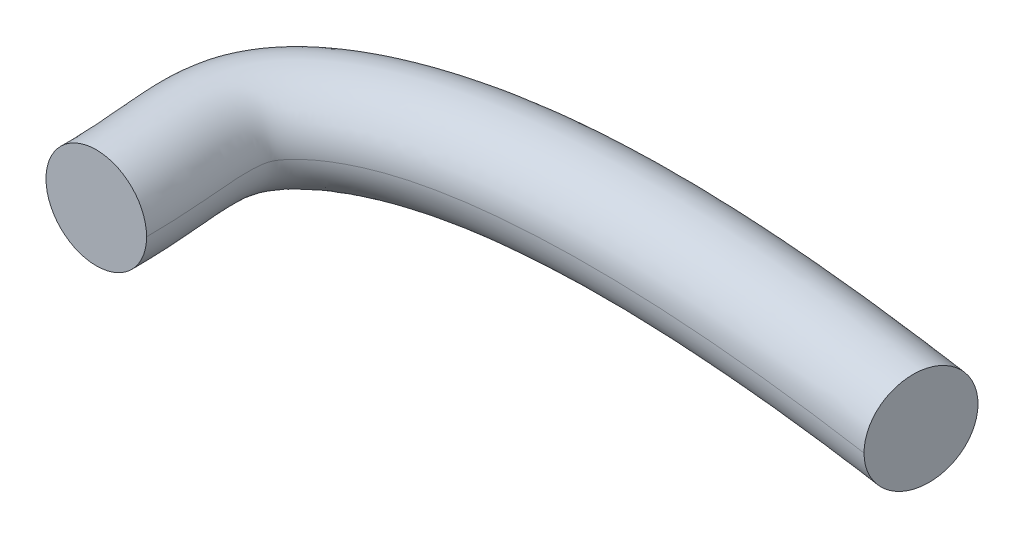
ISO-10303-21;
HEADER;
FILE_DESCRIPTION(('STEP AP214'),'2;1');
FILE_NAME('part.step','',(''),(''),'','','');
FILE_SCHEMA(('AUTOMOTIVE_DESIGN { 1 0 10303 214 1 1 1 1 }'));
ENDSEC;
DATA;
#1=APPLICATION_CONTEXT('core data for automotive mechanical design processes');
#2=APPLICATION_PROTOCOL_DEFINITION('international standard','automotive_design',2000,#1);
#3=PRODUCT_CONTEXT('',#1,'mechanical');
#4=PRODUCT('Part','Part','',(#3));
#5=PRODUCT_RELATED_PRODUCT_CATEGORY('part','',(#4));
#6=PRODUCT_DEFINITION_FORMATION('','',#4);
#7=PRODUCT_DEFINITION_CONTEXT('part definition',#1,'design');
#8=PRODUCT_DEFINITION('design','',#6,#7);
#9=PRODUCT_DEFINITION_SHAPE('','',#8);
#10=(LENGTH_UNIT() NAMED_UNIT(*) SI_UNIT(.MILLI.,.METRE.));
#11=(NAMED_UNIT(*) PLANE_ANGLE_UNIT() SI_UNIT($,.RADIAN.));
#12=(NAMED_UNIT(*) SI_UNIT($,.STERADIAN.) SOLID_ANGLE_UNIT());
#13=UNCERTAINTY_MEASURE_WITH_UNIT(LENGTH_MEASURE(1.E-05),#10,'distance_accuracy_value','');
#14=(GEOMETRIC_REPRESENTATION_CONTEXT(3) GLOBAL_UNCERTAINTY_ASSIGNED_CONTEXT((#13)) GLOBAL_UNIT_ASSIGNED_CONTEXT((#10,
#11,#12)) REPRESENTATION_CONTEXT('',''));
#15=CARTESIAN_POINT('',(0.,0.,0.));
#16=DIRECTION('',(0.,0.,1.));
#17=DIRECTION('',(1.,0.,0.));
#18=AXIS2_PLACEMENT_3D('',#15,#16,#17);
#19=CARTESIAN_POINT('',(-17.5010669160635,17.2,0.7));
#20=DIRECTION('',(0.,0.,1.));
#21=DIRECTION('',(1.,0.,0.));
#22=AXIS2_PLACEMENT_3D('',#19,#20,#21);
#23=PLANE('',#22);
#24=CARTESIAN_POINT('',(-18.0010669160634,17.2,0.7));
#25=CARTESIAN_POINT('',(-18.0010908044007,17.1718715968555,0.699999999999999));
#26=CARTESIAN_POINT('',(-17.9986947232915,17.1437503245222,0.7));
#27=CARTESIAN_POINT('',(-17.9892386494331,17.0883232759033,0.7));
#28=CARTESIAN_POINT('',(-17.9821820701335,17.0610169180443,0.700000000000001));
#29=CARTESIAN_POINT('',(-17.9635762365792,17.0079651780271,0.700000000000001));
#30=CARTESIAN_POINT('',(-17.9520248979197,16.9822205265085,0.7));
#31=CARTESIAN_POINT('',(-17.9247678316505,16.9330405609554,0.7));
#32=CARTESIAN_POINT('',(-17.909062920206,16.9096047944718,0.700000000000001));
#33=CARTESIAN_POINT('',(-17.873952130252,16.8657156692835,0.700000000000001));
#34=CARTESIAN_POINT('',(-17.854548495856,16.8452605153718,0.7));
#35=CARTESIAN_POINT('',(-17.8125548948616,16.8078690222403,0.7));
#36=CARTESIAN_POINT('',(-17.7899604839753,16.7909376739514,0.700000000000001));
#37=CARTESIAN_POINT('',(-17.7422851480738,16.7611345688834,0.700000000000001));
#38=CARTESIAN_POINT('',(-17.7172080947272,16.7482566179668,0.7));
#39=CARTESIAN_POINT('',(-17.6652055193307,16.7268718830678,0.7));
#40=CARTESIAN_POINT('',(-17.6382769821029,16.7183724302786,0.700000000000001));
#41=CARTESIAN_POINT('',(-17.583374631795,16.7060190706367,0.700000000000001));
#42=CARTESIAN_POINT('',(-17.5554008187786,16.7021651635003,0.7));
#43=CARTESIAN_POINT('',(-17.4992503968292,16.6992148253939,0.7));
#44=CARTESIAN_POINT('',(-17.4710742034152,16.7001104788733,0.700000000000001));
#45=CARTESIAN_POINT('',(-17.4152290913618,16.7066205301958,0.700000000000001));
#46=CARTESIAN_POINT('',(-17.3875609994691,16.7122420235647,0.7));
#47=CARTESIAN_POINT('',(-17.3335987676145,16.7280426143909,0.7));
#48=CARTESIAN_POINT('',(-17.3073028396406,16.7382156065342,0.700000000000001));
#49=CARTESIAN_POINT('',(-17.2567728215797,16.762837765867,0.700000000000001));
#50=CARTESIAN_POINT('',(-17.2325401755531,16.7772898967967,0.7));
#51=CARTESIAN_POINT('',(-17.1868463981911,16.8100566513247,0.7));
#52=CARTESIAN_POINT('',(-17.165385130427,16.8283710846734,0.700000000000001));
#53=CARTESIAN_POINT('',(-17.1258407555528,16.8683438436016,0.700000000000001));
#54=CARTESIAN_POINT('',(-17.1077578194591,16.8900023383615,0.7));
#55=CARTESIAN_POINT('',(-17.0754859965782,16.9360471920271,0.7));
#56=CARTESIAN_POINT('',(-17.0612969074891,16.9604334091234,0.700000000000001));
#57=CARTESIAN_POINT('',(-17.0372034896095,17.0112599058752,0.700000000000001));
#58=CARTESIAN_POINT('',(-17.0273025665998,17.0377017986192,0.7));
#59=CARTESIAN_POINT('',(-17.0120996364367,17.0918396699149,0.7));
#60=CARTESIAN_POINT('',(-17.0067906052536,17.1195336646423,0.7));
#61=CARTESIAN_POINT('',(-17.001987525221,17.1649165188812,0.7));
#62=CARTESIAN_POINT('',(-17.0010594466211,17.1824628719965,0.7));
#63=CARTESIAN_POINT('',(-17.0010669160634,17.2,0.7));
#64=B_SPLINE_CURVE_WITH_KNOTS('',3,(#24,#25,#26,#27,#28,#29,#30,#31,#32,#33,#34,#35,#36,#37,#38,
#39,#40,#41,#42,#43,#44,#45,#46,#47,#48,#49,#50,#51,#52,#53,#54,#55,#56,#57,#58,#59,#60,#61,#62,
#63),.UNSPECIFIED.,.F.,.F.,(4,2,2,2,2,2,2,2,2,2,2,2,2,2,2,2,2,2,2,4),(0.,0.0842731266473957,
0.168484598182507,0.252735168669721,0.336969196439847,0.421152278926405,0.505453794405462,
0.589625853237819,0.673938392248186,0.758250926107538,0.842422990094128,0.926721658867325,
1.01090758808816,1.0951519615927,1.17939218635094,1.26363667432552,1.34787678461367,
1.43218367859528,1.5163613825227,1.5689727282428),.UNSPECIFIED.);
#65=CARTESIAN_POINT('',(-18.0010669160634,17.2,0.7));
#66=VERTEX_POINT('',#65);
#67=CARTESIAN_POINT('',(-17.0010669160634,17.2,0.7));
#68=VERTEX_POINT('',#67);
#69=EDGE_CURVE('E55',#66,#68,#64,.T.);
#70=ORIENTED_EDGE('',*,*,#69,.T.);
#71=CARTESIAN_POINT('',(-17.0010669160634,17.2,0.7));
#72=CARTESIAN_POINT('',(-17.0010430277261,17.2281284031445,0.7));
#73=CARTESIAN_POINT('',(-17.0034391088352,17.2562496754778,0.7));
#74=CARTESIAN_POINT('',(-17.0128951826937,17.3116767240967,0.7));
#75=CARTESIAN_POINT('',(-17.0199517619933,17.3389830819557,0.700000000000001));
#76=CARTESIAN_POINT('',(-17.0385575955476,17.3920348219729,0.7));
#77=CARTESIAN_POINT('',(-17.050108934207,17.4177794734915,0.7));
#78=CARTESIAN_POINT('',(-17.0773660004763,17.4669594390446,0.7));
#79=CARTESIAN_POINT('',(-17.0930709119208,17.4903952055281,0.700000000000001));
#80=CARTESIAN_POINT('',(-17.1281817018748,17.5342843307165,0.700000000000001));
#81=CARTESIAN_POINT('',(-17.1475853362708,17.5547394846282,0.7));
#82=CARTESIAN_POINT('',(-17.1895789372652,17.5921309777597,0.7));
#83=CARTESIAN_POINT('',(-17.2121733481515,17.6090623260486,0.700000000000001));
#84=CARTESIAN_POINT('',(-17.259848684053,17.6388654311166,0.700000000000001));
#85=CARTESIAN_POINT('',(-17.2849257373996,17.6517433820332,0.7));
#86=CARTESIAN_POINT('',(-17.3369283127961,17.6731281169322,0.7));
#87=CARTESIAN_POINT('',(-17.3638568500239,17.6816275697214,0.700000000000001));
#88=CARTESIAN_POINT('',(-17.4187592003318,17.6939809293633,0.700000000000001));
#89=CARTESIAN_POINT('',(-17.4467330133482,17.6978348364997,0.7));
#90=CARTESIAN_POINT('',(-17.5028834352976,17.7007851746061,0.7));
#91=CARTESIAN_POINT('',(-17.5310596287116,17.6998895211267,0.700000000000001));
#92=CARTESIAN_POINT('',(-17.586904740765,17.6933794698042,0.700000000000001));
#93=CARTESIAN_POINT('',(-17.6145728326577,17.6877579764353,0.7));
#94=CARTESIAN_POINT('',(-17.6685350645123,17.6719573856091,0.7));
#95=CARTESIAN_POINT('',(-17.6948309924862,17.6617843934658,0.700000000000001));
#96=CARTESIAN_POINT('',(-17.7453610105471,17.637162234133,0.700000000000001));
#97=CARTESIAN_POINT('',(-17.7695936565737,17.6227101032033,0.7));
#98=CARTESIAN_POINT('',(-17.8152874339357,17.5899433486753,0.7));
#99=CARTESIAN_POINT('',(-17.8367487016998,17.5716289153266,0.700000000000001));
#100=CARTESIAN_POINT('',(-17.876293076574,17.5316561563984,0.700000000000001));
#101=CARTESIAN_POINT('',(-17.8943760126677,17.5099976616386,0.7));
#102=CARTESIAN_POINT('',(-17.9266478355486,17.4639528079729,0.7));
#103=CARTESIAN_POINT('',(-17.9408369246377,17.4395665908766,0.700000000000001));
#104=CARTESIAN_POINT('',(-17.9649303425173,17.3887400941248,0.700000000000001));
#105=CARTESIAN_POINT('',(-17.974831265527,17.3622982013808,0.7));
#106=CARTESIAN_POINT('',(-17.9900341956901,17.3081603300851,0.7));
#107=CARTESIAN_POINT('',(-17.9953432268732,17.2804663353577,0.7));
#108=CARTESIAN_POINT('',(-18.0001463069058,17.2350834811188,0.7));
#109=CARTESIAN_POINT('',(-18.0010743855056,17.2175371280035,0.7));
#110=CARTESIAN_POINT('',(-18.0010669160634,17.2,0.7));
#111=B_SPLINE_CURVE_WITH_KNOTS('',3,(#71,#72,#73,#74,#75,#76,#77,#78,#79,#80,#81,#82,#83,#84,
#85,#86,#87,#88,#89,#90,#91,#92,#93,#94,#95,#96,#97,#98,#99,#100,#101,#102,#103,#104,#105,#106,
#107,#108,#109,#110),.UNSPECIFIED.,.F.,.F.,(4,2,2,2,2,2,2,2,2,2,2,2,2,2,2,2,2,2,2,4),(0.,
0.0842731266473989,0.168484598182508,0.252735168669721,0.33696919643984,0.421152278926401,
0.505453794405461,0.589625853237816,0.673938392248183,0.758250926107535,0.842422990094128,
0.926721658867325,1.01090758808817,1.0951519615927,1.17939218635094,1.26363667432552,
1.34787678461367,1.43218367859529,1.51636138252271,1.5689727282428),.UNSPECIFIED.);
#112=EDGE_CURVE('E45',#68,#66,#111,.T.);
#113=ORIENTED_EDGE('',*,*,#112,.T.);
#114=EDGE_LOOP('',(#70,#113));
#115=FACE_BOUND('',#114,.T.);
#116=ADVANCED_FACE('F17',(#115),#23,.T.);
#117=CARTESIAN_POINT('',(-10.1471793061523,17.0266383810018,-0.813800640041871));
#118=CARTESIAN_POINT('',(-10.147950343177,17.0669301913861,-0.809614976968436));
#119=CARTESIAN_POINT('',(-10.1487213802016,17.1072220017704,-0.805429313895));
#120=CARTESIAN_POINT('',(-10.1494924172262,17.1475138121547,-0.801243650821565));
#121=CARTESIAN_POINT('',(-10.1498316435302,17.1652406417112,-0.799402121856344));
#122=CARTESIAN_POINT('',(-10.149993222375,17.1827586206897,-0.798524972533437));
#123=CARTESIAN_POINT('',(-10.149993222375,17.2,-0.798524972533437));
#124=CARTESIAN_POINT('',(-10.1499932223749,18.2,-0.798524972533436));
#125=CARTESIAN_POINT('',(-9.9687017585208,18.2,-1.7826865128359));
#126=CARTESIAN_POINT('',(-9.9687017585208,17.2,-1.7826865128359));
#127=CARTESIAN_POINT('',(-9.9687017585208,17.1827586206897,-1.7826865128359));
#128=CARTESIAN_POINT('',(-9.9688633373656,17.1652406417112,-1.781809363513));
#129=CARTESIAN_POINT('',(-9.9692025636696,17.1475138121547,-1.7799678345478));
#130=CARTESIAN_POINT('',(-9.9699736006942,17.1072220017704,-1.7757821714743));
#131=CARTESIAN_POINT('',(-9.9707446377188,17.0669301913861,-1.7715965084009));
#132=CARTESIAN_POINT('',(-9.9715156747434,17.0266383810018,-1.7674108453275));
#133=CARTESIAN_POINT('',(-10.6216867350942,17.0266383810018,-0.882717746146352));
#134=CARTESIAN_POINT('',(-10.6224045238828,17.0669301913861,-0.878524349338438));
#135=CARTESIAN_POINT('',(-10.6231223126714,17.1072220017704,-0.874330952530524));
#136=CARTESIAN_POINT('',(-10.6238401014601,17.1475138121547,-0.87013755572261));
#137=CARTESIAN_POINT('',(-10.6241559006111,17.1652406417112,-0.868292624214996));
#138=CARTESIAN_POINT('',(-10.6243063207331,17.1827586206897,-0.867413854207422));
#139=CARTESIAN_POINT('',(-10.6243063207331,17.2,-0.867413854207422));
#140=CARTESIAN_POINT('',(-10.624306320733,18.2,-0.867413854207421));
#141=CARTESIAN_POINT('',(-10.4555349439064,18.2,-1.8533938027055));
#142=CARTESIAN_POINT('',(-10.4555349439064,17.2,-1.8533938027055));
#143=CARTESIAN_POINT('',(-10.4555349439064,17.1827586206897,-1.8533938027055));
#144=CARTESIAN_POINT('',(-10.4556853640284,17.1652406417112,-1.8525150326979));
#145=CARTESIAN_POINT('',(-10.4560011631794,17.1475138121547,-1.8506701011903));
#146=CARTESIAN_POINT('',(-10.456718951968,17.1072220017704,-1.8464767043824));
#147=CARTESIAN_POINT('',(-10.4574367407567,17.0669301913861,-1.8422833075745));
#148=CARTESIAN_POINT('',(-10.4581545295453,17.0266383810018,-1.8380899107665));
#149=CARTESIAN_POINT('',(-11.096194164036,17.0266383810018,-0.951634852250831));
#150=CARTESIAN_POINT('',(-11.0968587045887,17.0669301913861,-0.947433721708439));
#151=CARTESIAN_POINT('',(-11.0975232451413,17.1072220017704,-0.943232591166047));
#152=CARTESIAN_POINT('',(-11.098187785694,17.1475138121547,-0.939031460623655));
#153=CARTESIAN_POINT('',(-11.0984801576921,17.1652406417112,-0.937183126573647));
#154=CARTESIAN_POINT('',(-11.0986194190912,17.1827586206897,-0.936302735881407));
#155=CARTESIAN_POINT('',(-11.0986194190912,17.2,-0.936302735881407));
#156=CARTESIAN_POINT('',(-11.0986194190912,18.2,-0.936302735881406));
#157=CARTESIAN_POINT('',(-10.942368129292,18.2,-1.924101092575));
#158=CARTESIAN_POINT('',(-10.942368129292,17.2,-1.924101092575));
#159=CARTESIAN_POINT('',(-10.942368129292,17.1827586206897,-1.924101092575));
#160=CARTESIAN_POINT('',(-10.9425073906911,17.1652406417112,-1.9232207018828));
#161=CARTESIAN_POINT('',(-10.9427997626892,17.1475138121547,-1.9213723678328));
#162=CARTESIAN_POINT('',(-10.9434643032419,17.1072220017704,-1.9171712372904));
#163=CARTESIAN_POINT('',(-10.9441288437945,17.0669301913861,-1.912970106748));
#164=CARTESIAN_POINT('',(-10.9447933843472,17.0266383810018,-1.9087689762056));
#165=CARTESIAN_POINT('',(-11.5707015929779,17.0266383810018,-1.0205519583553));
#166=CARTESIAN_POINT('',(-11.5713128852945,17.0669301913861,-1.0163430940784));
#167=CARTESIAN_POINT('',(-11.5719241776112,17.1072220017704,-1.0121342298016));
#168=CARTESIAN_POINT('',(-11.5725354699278,17.1475138121547,-1.0079253655247));
#169=CARTESIAN_POINT('',(-11.572804414773,17.1652406417112,-1.0060736289323));
#170=CARTESIAN_POINT('',(-11.5729325174493,17.1827586206897,-1.0051916175554));
#171=CARTESIAN_POINT('',(-11.5729325174493,17.2,-1.0051916175554));
#172=CARTESIAN_POINT('',(-11.5729325174493,18.2,-1.0051916175554));
#173=CARTESIAN_POINT('',(-11.4292013146776,18.2,-1.9948083824446));
#174=CARTESIAN_POINT('',(-11.4292013146776,17.2,-1.9948083824446));
#175=CARTESIAN_POINT('',(-11.4292013146776,17.1827586206897,-1.9948083824446));
#176=CARTESIAN_POINT('',(-11.4293294173538,17.1652406417112,-1.9939263710677));
#177=CARTESIAN_POINT('',(-11.429598362199,17.1475138121547,-1.9920746344753));
#178=CARTESIAN_POINT('',(-11.4302096545157,17.1072220017704,-1.9878657701984));
#179=CARTESIAN_POINT('',(-11.4308209468324,17.0669301913861,-1.9836569059216));
#180=CARTESIAN_POINT('',(-11.431432239149,17.0266383810018,-1.9794480416447));
#181=CARTESIAN_POINT('',(-13.9111578650092,17.0266383810018,-1.3604780867874));
#182=CARTESIAN_POINT('',(-13.9115065161947,17.0669301913861,-1.3562310767066));
#183=CARTESIAN_POINT('',(-13.9118551673801,17.1072220017704,-1.3519840666258));
#184=CARTESIAN_POINT('',(-13.9122038185656,17.1475138121547,-1.3477370565449));
#185=CARTESIAN_POINT('',(-13.9123572115276,17.1652406417112,-1.3458685372823));
#186=CARTESIAN_POINT('',(-13.9124302750174,17.1827586206897,-1.3449785320546));
#187=CARTESIAN_POINT('',(-13.9124302750174,17.2,-1.3449785320546));
#188=CARTESIAN_POINT('',(-13.9124302750174,18.2,-1.3449785320546));
#189=CARTESIAN_POINT('',(-13.83045303946,18.2,-2.3435643975456));
#190=CARTESIAN_POINT('',(-13.83045303946,17.2,-2.3435643975456));
#191=CARTESIAN_POINT('',(-13.83045303946,17.1827586206897,-2.3435643975456));
#192=CARTESIAN_POINT('',(-13.8305261029498,17.1652406417112,-2.3426743923179));
#193=CARTESIAN_POINT('',(-13.8306794959118,17.1475138121547,-2.3408058730553));
#194=CARTESIAN_POINT('',(-13.8310281470973,17.1072220017704,-2.3365588629744));
#195=CARTESIAN_POINT('',(-13.8313767982828,17.0669301913861,-2.3323118528936));
#196=CARTESIAN_POINT('',(-13.8317254494683,17.0266383810018,-2.3280648428128));
#197=CARTESIAN_POINT('',(-15.5288191612442,17.0266383810018,-1.344804822665));
#198=CARTESIAN_POINT('',(-15.5288110738282,17.0669301913861,-1.3402953603798));
#199=CARTESIAN_POINT('',(-15.5288029864123,17.1072220017704,-1.3357858980946));
#200=CARTESIAN_POINT('',(-15.5287948989963,17.1475138121547,-1.3312764358093));
#201=CARTESIAN_POINT('',(-15.5287913408478,17.1652406417112,-1.329292447784));
#202=CARTESIAN_POINT('',(-15.5287896460455,17.1827586206897,-1.3283474429614));
#203=CARTESIAN_POINT('',(-15.5287896460456,17.2,-1.3283474429613));
#204=CARTESIAN_POINT('',(-15.5287896460474,18.2,-1.3283474429606));
#205=CARTESIAN_POINT('',(-15.5306912142562,18.2,-2.3886428539114));
#206=CARTESIAN_POINT('',(-15.5306912142534,17.2,-2.3886428539121));
#207=CARTESIAN_POINT('',(-15.5306912142534,17.1827586206897,-2.3886428539121));
#208=CARTESIAN_POINT('',(-15.530689519451,17.1652406417112,-2.3876978490895));
#209=CARTESIAN_POINT('',(-15.5306859613024,17.1475138121547,-2.3857138610642));
#210=CARTESIAN_POINT('',(-15.5306778738863,17.1072220017704,-2.381204398779));
#211=CARTESIAN_POINT('',(-15.5306697864701,17.0669301913861,-2.3766949364938));
#212=CARTESIAN_POINT('',(-15.530661699054,17.0266383810018,-2.3721854742086));
#213=CARTESIAN_POINT('',(-16.7983849518084,17.0266383810018,-0.894768994742262));
#214=CARTESIAN_POINT('',(-16.7962675036495,17.0669301913861,-0.891007259145851));
#215=CARTESIAN_POINT('',(-16.7941500554907,17.1072220017704,-0.887245523549439));
#216=CARTESIAN_POINT('',(-16.7920326073318,17.1475138121547,-0.883483787953028));
#217=CARTESIAN_POINT('',(-16.7911010124928,17.1652406417112,-0.881828770590484));
#218=CARTESIAN_POINT('',(-16.7906572791616,17.1827586206897,-0.881040459688855));
#219=CARTESIAN_POINT('',(-16.7906572791616,17.2,-0.881040459688861));
#220=CARTESIAN_POINT('',(-16.7906572791607,18.2,-0.881040459689203));
#221=CARTESIAN_POINT('',(-17.2885260767541,18.2,-1.7655252913242));
#222=CARTESIAN_POINT('',(-17.2885260767555,17.2,-1.7655252913239));
#223=CARTESIAN_POINT('',(-17.2885260767555,17.1827586206897,-1.7655252913239));
#224=CARTESIAN_POINT('',(-17.2880823434243,17.1652406417112,-1.7647369804222));
#225=CARTESIAN_POINT('',(-17.2871507485854,17.1475138121547,-1.7630819630597));
#226=CARTESIAN_POINT('',(-17.2850333004266,17.1072220017704,-1.7593202274632));
#227=CARTESIAN_POINT('',(-17.2829158522678,17.0669301913861,-1.7555584918668));
#228=CARTESIAN_POINT('',(-17.280798404109,17.0266383810018,-1.7517967562704));
#229=CARTESIAN_POINT('',(-17.0040745426561,17.0266383810024,-0.684018160967294));
#230=CARTESIAN_POINT('',(-17.0007683769681,17.0669301913867,-0.680745057832251));
#231=CARTESIAN_POINT('',(-16.9974622112801,17.107222001771,-0.677471954697208));
#232=CARTESIAN_POINT('',(-16.9941560455921,17.1475138121553,-0.674198851562165));
#233=CARTESIAN_POINT('',(-16.9927014612714,17.1652406417118,-0.67275881347893));
#234=CARTESIAN_POINT('',(-16.9920086197923,17.1827586206903,-0.672072900602458));
#235=CARTESIAN_POINT('',(-16.9920086197923,17.2000000000006,-0.672072900602489));
#236=CARTESIAN_POINT('',(-16.9920086197917,18.2000000000006,-0.672072900604263));
#237=CARTESIAN_POINT('',(-17.7693767592938,18.2000000000006,-1.4416671480404));
#238=CARTESIAN_POINT('',(-17.7693767592944,17.2000000000006,-1.4416671480388));
#239=CARTESIAN_POINT('',(-17.7693767592944,17.1827586206903,-1.4416671480388));
#240=CARTESIAN_POINT('',(-17.7686839178154,17.1652406417118,-1.4409812351622));
#241=CARTESIAN_POINT('',(-17.7672293334947,17.1475138121553,-1.4395411970789));
#242=CARTESIAN_POINT('',(-17.7639231678067,17.107222001771,-1.4362680939438));
#243=CARTESIAN_POINT('',(-17.7606170021188,17.0669301913867,-1.4329949908086));
#244=CARTESIAN_POINT('',(-17.7573108364308,17.0266383810024,-1.4297218876734));
#245=CARTESIAN_POINT('',(-17.0720708607795,17.0266383810015,-0.5050264774106));
#246=CARTESIAN_POINT('',(-17.0677320210611,17.0669301913858,-0.504471759581982));
#247=CARTESIAN_POINT('',(-17.0633931813428,17.1072220017701,-0.503917041753364));
#248=CARTESIAN_POINT('',(-17.0590543416245,17.1475138121544,-0.503362323924746));
#249=CARTESIAN_POINT('',(-17.0571454208928,17.1652406417109,-0.503118269654012));
#250=CARTESIAN_POINT('',(-17.0562361718074,17.1827586206894,-0.503002022751364));
#251=CARTESIAN_POINT('',(-17.0562361718074,17.1999999999997,-0.503002022751348));
#252=CARTESIAN_POINT('',(-17.0562361718077,18.1999999999997,-0.503002022750401));
#253=CARTESIAN_POINT('',(-18.0764136455873,18.1999999999997,-0.633431047502523));
#254=CARTESIAN_POINT('',(-18.076413645587,17.1999999999997,-0.633431047503388));
#255=CARTESIAN_POINT('',(-18.076413645587,17.1827586206894,-0.633431047503403));
#256=CARTESIAN_POINT('',(-18.0755043965016,17.1652406417109,-0.633314800600787));
#257=CARTESIAN_POINT('',(-18.0735954757699,17.1475138121544,-0.633070746330086));
#258=CARTESIAN_POINT('',(-18.0692566360515,17.1072220017701,-0.632516028501541));
#259=CARTESIAN_POINT('',(-18.0649177963332,17.0669301913858,-0.631961310672996));
#260=CARTESIAN_POINT('',(-18.0605789566148,17.0266383810015,-0.631406592844451));
#261=CARTESIAN_POINT('',(-17.0815899786064,17.0266383810018,-0.398808490003821));
#262=CARTESIAN_POINT('',(-17.0773361948474,17.0669301913861,-0.398948048260954));
#263=CARTESIAN_POINT('',(-17.0730824110883,17.1072220017704,-0.399087606518087));
#264=CARTESIAN_POINT('',(-17.0688286273293,17.1475138121547,-0.399227164775219));
#265=CARTESIAN_POINT('',(-17.0669571279117,17.1652406417112,-0.399288564980715));
#266=CARTESIAN_POINT('',(-17.0660657031891,17.1827586206897,-0.39931781086807));
#267=CARTESIAN_POINT('',(-17.0660657031891,17.2,-0.39931781086807));
#268=CARTESIAN_POINT('',(-17.0660657031889,18.2,-0.399317810868072));
#269=CARTESIAN_POINT('',(-18.0662442419231,18.2,-0.366503925256155));
#270=CARTESIAN_POINT('',(-18.0662442419231,17.2,-0.366503925256155));
#271=CARTESIAN_POINT('',(-18.0662442419231,17.1827586206897,-0.366503925256155));
#272=CARTESIAN_POINT('',(-18.0653528172005,17.1652406417112,-0.36653317114351));
#273=CARTESIAN_POINT('',(-18.063481317783,17.1475138121547,-0.366594571349006));
#274=CARTESIAN_POINT('',(-18.0592275340239,17.1072220017704,-0.366734129606139));
#275=CARTESIAN_POINT('',(-18.0549737502648,17.0669301913861,-0.366873687863272));
#276=CARTESIAN_POINT('',(-18.0507199665058,17.0266383810018,-0.367013246120404));
#277=CARTESIAN_POINT('',(-17.0516312982924,17.0266383810018,0.0245596116889331));
#278=CARTESIAN_POINT('',(-17.0474002500548,17.0669301913861,0.0240987591037574));
#279=CARTESIAN_POINT('',(-17.0431692018173,17.1072220017704,0.0236379065185817));
#280=CARTESIAN_POINT('',(-17.0389381535798,17.1475138121547,0.023177053933406));
#281=CARTESIAN_POINT('',(-17.0370766569074,17.1652406417112,0.0229742967192183));
#282=CARTESIAN_POINT('',(-17.0361899966503,17.1827586206897,0.022877720256671));
#283=CARTESIAN_POINT('',(-17.0361899966503,17.2,0.0228777202566711));
#284=CARTESIAN_POINT('',(-17.0361899966505,18.2,0.0228777202566693));
#285=CARTESIAN_POINT('',(-18.0310228050981,18.2,0.13123651123472));
#286=CARTESIAN_POINT('',(-18.0310228050982,17.2,0.13123651123472));
#287=CARTESIAN_POINT('',(-18.0310228050981,17.1827586206897,0.13123651123472));
#288=CARTESIAN_POINT('',(-18.0301361448411,17.1652406417112,0.131139934772172));
#289=CARTESIAN_POINT('',(-18.0282746481687,17.1475138121547,0.130937177557985));
#290=CARTESIAN_POINT('',(-18.0240435999312,17.1072220017704,0.130476324972809));
#291=CARTESIAN_POINT('',(-18.0198125516936,17.0669301913861,0.130015472387633));
#292=CARTESIAN_POINT('',(-18.0155815034561,17.0266383810018,0.129554619802458));
#293=CARTESIAN_POINT('',(-17.0165884533661,17.0266383810018,0.321220559574146));
#294=CARTESIAN_POINT('',(-17.012335428966,17.0669301913861,0.3209559244529));
#295=CARTESIAN_POINT('',(-17.0080824045658,17.1072220017704,0.320691289331655));
#296=CARTESIAN_POINT('',(-17.0038293801656,17.1475138121547,0.320426654210409));
#297=CARTESIAN_POINT('',(-17.0019582148365,17.1652406417112,0.320310225049142));
#298=CARTESIAN_POINT('',(-17.0010669492454,17.1827586206897,0.320254768001275));
#299=CARTESIAN_POINT('',(-17.0010669492455,17.2,0.320254768001275));
#300=CARTESIAN_POINT('',(-17.0010669492458,18.2,0.320254768001274));
#301=CARTESIAN_POINT('',(-18.0010669423618,18.2,0.382477575707931));
#302=CARTESIAN_POINT('',(-18.0010669423619,17.2,0.382477575707931));
#303=CARTESIAN_POINT('',(-18.0010669423619,17.1827586206897,0.382477575707931));
#304=CARTESIAN_POINT('',(-18.0001756767708,17.1652406417112,0.382422118660064));
#305=CARTESIAN_POINT('',(-17.9983045114416,17.1475138121547,0.382305689498796));
#306=CARTESIAN_POINT('',(-17.9940514870415,17.1072220017704,0.382041054377551));
#307=CARTESIAN_POINT('',(-17.9897984626413,17.0669301913861,0.381776419256305));
#308=CARTESIAN_POINT('',(-17.9855454382411,17.0266383810018,0.38151178413506));
#309=CARTESIAN_POINT('',(-17.016588420291,17.0266383810018,0.700000000000001));
#310=CARTESIAN_POINT('',(-17.0123353958616,17.0669301913861,0.700000000000001));
#311=CARTESIAN_POINT('',(-17.0080823714321,17.1072220017704,0.7));
#312=CARTESIAN_POINT('',(-17.0038293470027,17.1475138121547,0.7));
#313=CARTESIAN_POINT('',(-17.0019581816606,17.1652406417112,0.7));
#314=CARTESIAN_POINT('',(-17.0010669160634,17.1827586206897,0.7));
#315=CARTESIAN_POINT('',(-17.0010669160634,17.2,0.7));
#316=CARTESIAN_POINT('',(-17.0010669160634,18.2,0.700000000000003));
#317=CARTESIAN_POINT('',(-18.0010669160634,18.2,0.700000000000003));
#318=CARTESIAN_POINT('',(-18.0010669160634,17.2,0.7));
#319=CARTESIAN_POINT('',(-18.0010669160634,17.1827586206897,0.7));
#320=CARTESIAN_POINT('',(-18.0001756504663,17.1652406417112,0.7));
#321=CARTESIAN_POINT('',(-17.9983044851242,17.1475138121547,0.7));
#322=CARTESIAN_POINT('',(-17.9940514606948,17.1072220017704,0.7));
#323=CARTESIAN_POINT('',(-17.9897984362653,17.0669301913861,0.7));
#324=CARTESIAN_POINT('',(-17.9855454118359,17.0266383810018,0.699999999999999));
#325=CARTESIAN_POINT('',(-17.0165883951983,17.0266383810018,0.987364636262079));
#326=CARTESIAN_POINT('',(-17.0123353707466,17.0669301913861,0.987565404221589));
#327=CARTESIAN_POINT('',(-17.0080823462949,17.1072220017704,0.9877661721811));
#328=CARTESIAN_POINT('',(-17.0038293218433,17.1475138121547,0.98796694014061));
#329=CARTESIAN_POINT('',(-17.0019581564914,17.1652406417112,0.98805527023461));
#330=CARTESIAN_POINT('',(-17.0010668908896,17.1827586206897,0.988097343253068));
#331=CARTESIAN_POINT('',(-17.0010668908896,17.2,0.988097343253067));
#332=CARTESIAN_POINT('',(-17.0010668908893,18.2,0.988097343253073));
#333=CARTESIAN_POINT('',(-18.0010668961119,18.2,0.940891416543519));
#334=CARTESIAN_POINT('',(-18.0010668961119,17.2,0.940891416543514));
#335=CARTESIAN_POINT('',(-18.0010668961119,17.1827586206897,0.940891416543514));
#336=CARTESIAN_POINT('',(-18.0001756305101,17.1652406417112,0.940933489561972));
#337=CARTESIAN_POINT('',(-17.9983044651583,17.1475138121547,0.941021819655972));
#338=CARTESIAN_POINT('',(-17.9940514407066,17.1072220017704,0.941222587615482));
#339=CARTESIAN_POINT('',(-17.9897984162549,17.0669301913861,0.941423355574992));
#340=CARTESIAN_POINT('',(-17.9855453918033,17.0266383810018,0.941624123534502));
#341=CARTESIAN_POINT('',(-17.0165883701055,17.0266383810018,1.2747292725242));
#342=CARTESIAN_POINT('',(-17.0123353456316,17.0669301913861,1.2751308084432));
#343=CARTESIAN_POINT('',(-17.0080823211577,17.1072220017704,1.2755323443622));
#344=CARTESIAN_POINT('',(-17.0038292966839,17.1475138121547,1.2759338802812));
#345=CARTESIAN_POINT('',(-17.0019581313222,17.1652406417112,1.2761105404692));
#346=CARTESIAN_POINT('',(-17.0010668657158,17.1827586206897,1.2761946865061));
#347=CARTESIAN_POINT('',(-17.0010668657158,17.2,1.2761946865061));
#348=CARTESIAN_POINT('',(-17.0010668657152,18.2,1.2761946865061));
#349=CARTESIAN_POINT('',(-18.0010668761604,18.2,1.181782833087));
#350=CARTESIAN_POINT('',(-18.0010668761604,17.2,1.181782833087));
#351=CARTESIAN_POINT('',(-18.0010668761604,17.1827586206897,1.181782833087));
#352=CARTESIAN_POINT('',(-18.0001756105539,17.1652406417112,1.1818669791239));
#353=CARTESIAN_POINT('',(-17.9983044451923,17.1475138121547,1.1820436393119));
#354=CARTESIAN_POINT('',(-17.9940514207184,17.1072220017704,1.182445175231));
#355=CARTESIAN_POINT('',(-17.9897983962446,17.0669301913861,1.18284671115));
#356=CARTESIAN_POINT('',(-17.9855453717707,17.0266383810018,1.183248247069));
#357=CARTESIAN_POINT('',(-17.0165883450128,17.0266383810018,1.5620939087862));
#358=CARTESIAN_POINT('',(-17.0123353205167,17.0669301913861,1.5626962126648));
#359=CARTESIAN_POINT('',(-17.0080822960205,17.1072220017704,1.5632985165433));
#360=CARTESIAN_POINT('',(-17.0038292715244,17.1475138121547,1.5639008204218));
#361=CARTESIAN_POINT('',(-17.001958106153,17.1652406417112,1.5641658107038));
#362=CARTESIAN_POINT('',(-17.0010668405419,17.1827586206897,1.5642920297592));
#363=CARTESIAN_POINT('',(-17.0010668405419,17.2,1.5642920297592));
#364=CARTESIAN_POINT('',(-17.0010668405411,18.2,1.5642920297592));
#365=CARTESIAN_POINT('',(-18.0010668562088,18.2,1.4226742496306));
#366=CARTESIAN_POINT('',(-18.0010668562088,17.2,1.4226742496305));
#367=CARTESIAN_POINT('',(-18.0010668562088,17.1827586206897,1.4226742496305));
#368=CARTESIAN_POINT('',(-18.0001755905977,17.1652406417112,1.4228004686859));
#369=CARTESIAN_POINT('',(-17.9983044252263,17.1475138121547,1.4230654589679));
#370=CARTESIAN_POINT('',(-17.9940514007303,17.1072220017704,1.4236677628464));
#371=CARTESIAN_POINT('',(-17.9897983762342,17.0669301913861,1.424270066725));
#372=CARTESIAN_POINT('',(-17.9855453517382,17.0266383810018,1.4248723706035));
#373=(BOUNDED_SURFACE() B_SPLINE_SURFACE(3,3,((#117,#118,#119,#120,#121,#122,#123,#124,#125,
#126,#127,#128,#129,#130,#131,#132),(#133,#134,#135,#136,#137,#138,#139,#140,#141,#142,#143,
#144,#145,#146,#147,#148),(#149,#150,#151,#152,#153,#154,#155,#156,#157,#158,#159,#160,#161,
#162,#163,#164),(#165,#166,#167,#168,#169,#170,#171,#172,#173,#174,#175,#176,#177,#178,#179,
#180),(#181,#182,#183,#184,#185,#186,#187,#188,#189,#190,#191,#192,#193,#194,#195,#196),(#197,
#198,#199,#200,#201,#202,#203,#204,#205,#206,#207,#208,#209,#210,#211,#212),(#213,#214,#215,
#216,#217,#218,#219,#220,#221,#222,#223,#224,#225,#226,#227,#228),(#229,#230,#231,#232,#233,
#234,#235,#236,#237,#238,#239,#240,#241,#242,#243,#244),(#245,#246,#247,#248,#249,#250,#251,
#252,#253,#254,#255,#256,#257,#258,#259,#260),(#261,#262,#263,#264,#265,#266,#267,#268,#269,
#270,#271,#272,#273,#274,#275,#276),(#277,#278,#279,#280,#281,#282,#283,#284,#285,#286,#287,
#288,#289,#290,#291,#292),(#293,#294,#295,#296,#297,#298,#299,#300,#301,#302,#303,#304,#305,
#306,#307,#308),(#309,#310,#311,#312,#313,#314,#315,#316,#317,#318,#319,#320,#321,#322,#323,
#324),(#325,#326,#327,#328,#329,#330,#331,#332,#333,#334,#335,#336,#337,#338,#339,#340),(#341,
#342,#343,#344,#345,#346,#347,#348,#349,#350,#351,#352,#353,#354,#355,#356),(#357,#358,#359,
#360,#361,#362,#363,#364,#365,#366,#367,#368,#369,#370,#371,#372)),.UNSPECIFIED.,.F.,.F.,
.F.) B_SPLINE_SURFACE_WITH_KNOTS((4,3,2,2,2,3,4),(4,3,3,3,3,4),(-0.1,0.,0.493239121092496,
0.736377137178142,0.868188568589071,1.,1.1),(0.92,0.975,1.,1.5,1.525,1.58),
.UNSPECIFIED.) GEOMETRIC_REPRESENTATION_ITEM() RATIONAL_B_SPLINE_SURFACE(((0.905,0.905,0.905,
0.905,0.935,0.966666666666667,1.,0.333333333333333,0.333333333333333,1.,0.966666666666667,0.935,
0.905,0.905,0.905,0.905),(0.905,0.905,0.905,0.905,0.935,0.966666666666667,1.,0.333333333333333,
0.333333333333333,1.,0.966666666666667,0.935,0.905,0.905,0.905,0.905),(0.905,0.905,0.905,0.905,
0.935,0.966666666666667,1.,0.333333333333333,0.333333333333333,1.,0.966666666666667,0.935,0.905,
0.905,0.905,0.905),(0.905,0.905,0.905,0.905,0.935,0.966666666666667,1.,0.333333333333333,
0.333333333333333,1.,0.966666666666667,0.935,0.905,0.905,0.905,0.905),(0.905,0.905,0.905,0.905,
0.935,0.966666666666667,1.,0.333333333333333,0.333333333333333,1.,0.966666666666667,0.935,0.905,
0.905,0.905,0.905),(0.905,0.905,0.905,0.905,0.935,0.966666666666667,1.,0.333333333333333,
0.333333333333333,1.,0.966666666666667,0.935,0.905,0.905,0.905,0.905),(0.905,0.905,0.905,0.905,
0.935,0.966666666666667,1.,0.333333333333333,0.333333333333333,1.,0.966666666666667,0.935,0.905,
0.905,0.905,0.905),(0.905,0.905,0.905,0.905,0.935,0.966666666666667,1.,0.333333333333333,
0.333333333333333,1.,0.966666666666667,0.935,0.905,0.905,0.905,0.905),(0.905,0.905,0.905,0.905,
0.935,0.966666666666667,1.,0.333333333333333,0.333333333333333,1.,0.966666666666667,0.935,0.905,
0.905,0.905,0.905),(0.905,0.905,0.905,0.905,0.935,0.966666666666667,1.,0.333333333333333,
0.333333333333333,1.,0.966666666666667,0.935,0.905,0.905,0.905,0.905),(0.905,0.905,0.905,0.905,
0.935,0.966666666666667,1.,0.333333333333333,0.333333333333333,1.,0.966666666666667,0.935,0.905,
0.905,0.905,0.905),(0.905,0.905,0.905,0.905,0.935,0.966666666666667,1.,0.333333333333333,
0.333333333333333,1.,0.966666666666667,0.935,0.905,0.905,0.905,0.905),(0.905,0.905,0.905,0.905,
0.935,0.966666666666667,1.,0.333333333333333,0.333333333333333,1.,0.966666666666667,0.935,0.905,
0.905,0.905,0.905),(0.905,0.905,0.905,0.905,0.935,0.966666666666667,1.,0.333333333333333,
0.333333333333333,1.,0.966666666666667,0.935,0.905,0.905,0.905,0.905),(0.905,0.905,0.905,0.905,
0.935,0.966666666666667,1.,0.333333333333333,0.333333333333333,1.,0.966666666666667,0.935,0.905,
0.905,0.905,0.905),(0.905,0.905,0.905,0.905,0.935,0.966666666666667,1.,0.333333333333333,
0.333333333333333,1.,0.966666666666667,0.935,0.905,0.905,0.905,0.905))) REPRESENTATION_ITEM('') SURFACE());
#374=CARTESIAN_POINT('',(-11.5729325174493,17.2,-1.0051916175554));
#375=CARTESIAN_POINT('',(-11.5729359509487,17.2281284031445,-1.00516797725626));
#376=CARTESIAN_POINT('',(-11.5725915593289,17.2562496754778,-1.00753917929196));
#377=CARTESIAN_POINT('',(-11.5712324264598,17.3116767240967,-1.01689706851231));
#378=CARTESIAN_POINT('',(-11.5702181758297,17.3389830819557,-1.02388037768994));
#379=CARTESIAN_POINT('',(-11.5675439369943,17.3920348219729,-1.04229302250008));
#380=CARTESIAN_POINT('',(-11.5658836491951,17.4177794734915,-1.05372442089435));
#381=CARTESIAN_POINT('',(-11.5619659582762,17.4669594390446,-1.08069847063613));
#382=CARTESIAN_POINT('',(-11.5597086724649,17.4903952055282,-1.09624031429265));
#383=CARTESIAN_POINT('',(-11.5546621563946,17.5342843307165,-1.13098654065963));
#384=CARTESIAN_POINT('',(-11.5518732486846,17.5547394846282,-1.15018870255777));
#385=CARTESIAN_POINT('',(-11.545837457905,17.5921309777597,-1.19174627411982));
#386=CARTESIAN_POINT('',(-11.5425899360524,17.6090623260486,-1.21410608192576));
#387=CARTESIAN_POINT('',(-11.5357375026808,17.6388654311166,-1.26128639360555));
#388=CARTESIAN_POINT('',(-11.5321331476412,17.6517433820332,-1.2861030660114));
#389=CARTESIAN_POINT('',(-11.5246587549323,17.6731281169322,-1.33756568644115));
#390=CARTESIAN_POINT('',(-11.5207882838877,17.6816275697214,-1.36421461833572));
#391=CARTESIAN_POINT('',(-11.5128971030429,17.6939809293633,-1.41854690463233));
#392=CARTESIAN_POINT('',(-11.5088763932519,17.6978348364998,-1.44623025897117));
#393=CARTESIAN_POINT('',(-11.500805825569,17.7007851746061,-1.50179765788793));
#394=CARTESIAN_POINT('',(-11.4967560274001,17.6998895211267,-1.52968129126116));
#395=CARTESIAN_POINT('',(-11.4887293422758,17.6933794698042,-1.58494655038629));
#396=CARTESIAN_POINT('',(-11.4847525741496,17.6877579764353,-1.61232735797587));
#397=CARTESIAN_POINT('',(-11.4769965176609,17.6719573856091,-1.66572928728999));
#398=CARTESIAN_POINT('',(-11.4732169723052,17.6617843934658,-1.69175217846133));
#399=CARTESIAN_POINT('',(-11.4659542320333,17.637162234133,-1.74175753146454));
#400=CARTESIAN_POINT('',(-11.4624712446735,17.6227101032033,-1.76573856423009));
#401=CARTESIAN_POINT('',(-11.4559036230941,17.5899433486753,-1.81095789235858));
#402=CARTESIAN_POINT('',(-11.4528189692654,17.5716289153266,-1.83219632273377));
#403=CARTESIAN_POINT('',(-11.4471352087018,17.5316561563984,-1.87133009906633));
#404=CARTESIAN_POINT('',(-11.4445361265474,17.5099976616386,-1.88922527578301));
#405=CARTESIAN_POINT('',(-11.4398976586291,17.4639528079729,-1.9211620127395));
#406=CARTESIAN_POINT('',(-11.4378582437881,17.4395665908766,-1.93520377318059));
#407=CARTESIAN_POINT('',(-11.4343952678574,17.3887400941248,-1.95904702343774));
#408=CARTESIAN_POINT('',(-11.4329721962846,17.3622982013808,-1.96884514283598));
#409=CARTESIAN_POINT('',(-11.4307870608466,17.3081603300851,-1.98389021740086));
#410=CARTESIAN_POINT('',(-11.4300239874092,17.2804663353577,-1.989144123665));
#411=CARTESIAN_POINT('',(-11.4293336349391,17.2350834811188,-1.99389733218829));
#412=CARTESIAN_POINT('',(-11.4292002410857,17.2175371280035,-1.99481577432988));
#413=CARTESIAN_POINT('',(-11.4292013146776,17.2,-1.9948083824446));
#414=B_SPLINE_CURVE_WITH_KNOTS('',3,(#374,#375,#376,#377,#378,#379,#380,#381,#382,#383,#384,
#385,#386,#387,#388,#389,#390,#391,#392,#393,#394,#395,#396,#397,#398,#399,#400,#401,#402,#403,
#404,#405,#406,#407,#408,#409,#410,#411,#412,#413),.UNSPECIFIED.,.F.,.F.,(4,2,2,2,2,2,2,2,2,2,2,
2,2,2,2,2,2,2,2,4),(0.,0.0842731266474023,0.168484598182516,0.252735168669729,0.336969196439853,
0.421152278926415,0.505453794405478,0.589625853237826,0.673938392248185,0.75825092610754,
0.84242299009413,0.926721658867328,1.01090758808816,1.0951519615927,1.17939218635093,
1.26363667432551,1.34787678461366,1.43218367859527,1.5163613825227,1.56897272824279),.UNSPECIFIED.);
#415=CARTESIAN_POINT('',(-11.5729325174493,17.2,-1.0051916175554));
#416=VERTEX_POINT('',#415);
#417=CARTESIAN_POINT('',(-11.4292013146776,17.2,-1.9948083824446));
#418=VERTEX_POINT('',#417);
#419=EDGE_CURVE('E36',#416,#418,#414,.T.);
#420=CARTESIAN_POINT('',(-9.9687017585208,17.2,-1.7826865128359));
#421=CARTESIAN_POINT('',(-10.4555349439064,17.2,-1.8533938027055));
#422=CARTESIAN_POINT('',(-10.942368129292,17.2,-1.924101092575));
#423=CARTESIAN_POINT('',(-11.4292013146776,17.2,-1.9948083824446));
#424=CARTESIAN_POINT('',(-13.83045303946,17.2,-2.3435643975456));
#425=CARTESIAN_POINT('',(-15.5306912142534,17.2,-2.3886428539121));
#426=CARTESIAN_POINT('',(-17.2885260767555,17.2,-1.7655252913239));
#427=CARTESIAN_POINT('',(-17.7693767592944,17.2000000000006,-1.4416671480388));
#428=CARTESIAN_POINT('',(-18.076413645587,17.1999999999997,-0.633431047503388));
#429=CARTESIAN_POINT('',(-18.0662442419231,17.2,-0.366503925256156));
#430=CARTESIAN_POINT('',(-18.0310228050982,17.2,0.13123651123472));
#431=CARTESIAN_POINT('',(-18.0010669423619,17.2,0.382477575707931));
#432=CARTESIAN_POINT('',(-18.0010669160634,17.2,0.7));
#433=CARTESIAN_POINT('',(-18.0010668961119,17.2,0.940891416543515));
#434=CARTESIAN_POINT('',(-18.0010668761604,17.2,1.181782833087));
#435=CARTESIAN_POINT('',(-18.0010668562088,17.2,1.4226742496305));
#436=(BOUNDED_CURVE() B_SPLINE_CURVE(3,(#420,#421,#422,#423,#424,#425,#426,#427,#428,#429,#430,
#431,#432,#433,#434,#435),.UNSPECIFIED.,.F.,.F.) B_SPLINE_CURVE_WITH_KNOTS((4,3,2,2,2,3,4),
(-0.1,0.,0.493239121092496,0.736377137178142,0.868188568589071,1.,1.1),
.UNSPECIFIED.) CURVE() GEOMETRIC_REPRESENTATION_ITEM() RATIONAL_B_SPLINE_CURVE((0.999999999999996,
0.999999999999996,0.999999999999996,0.999999999999996,0.999999999999996,0.999999999999996,
0.999999999999996,0.999999999999996,0.999999999999996,0.999999999999996,0.999999999999996,
0.999999999999996,0.999999999999996,0.999999999999996,0.999999999999996,0.999999999999996)) REPRESENTATION_ITEM(''));
#437=EDGE_CURVE('E50',#418,#66,#436,.T.);
#438=CARTESIAN_POINT('',(-17.0010668405419,17.2,1.5642920297592));
#439=CARTESIAN_POINT('',(-17.0010668657158,17.2,1.2761946865061));
#440=CARTESIAN_POINT('',(-17.0010668908896,17.2,0.988097343253067));
#441=CARTESIAN_POINT('',(-17.0010669160634,17.2,0.7));
#442=CARTESIAN_POINT('',(-17.0010669492455,17.2,0.320254768001275));
#443=CARTESIAN_POINT('',(-17.0361899966503,17.2,0.0228777202566711));
#444=CARTESIAN_POINT('',(-17.0660657031891,17.2,-0.39931781086807));
#445=CARTESIAN_POINT('',(-17.0562361718074,17.1999999999997,-0.503002022751348));
#446=CARTESIAN_POINT('',(-16.9920086197923,17.2000000000006,-0.672072900602489));
#447=CARTESIAN_POINT('',(-16.7906572791616,17.2,-0.881040459688861));
#448=CARTESIAN_POINT('',(-15.5287896460456,17.2,-1.3283474429613));
#449=CARTESIAN_POINT('',(-13.9124302750174,17.2,-1.3449785320546));
#450=CARTESIAN_POINT('',(-11.5729325174493,17.2,-1.0051916175554));
#451=CARTESIAN_POINT('',(-11.0986194190912,17.2,-0.936302735881407));
#452=CARTESIAN_POINT('',(-10.6243063207331,17.2,-0.867413854207422));
#453=CARTESIAN_POINT('',(-10.149993222375,17.2,-0.798524972533437));
#454=(BOUNDED_CURVE() B_SPLINE_CURVE(3,(#438,#439,#440,#441,#442,#443,#444,#445,#446,#447,#448,
#449,#450,#451,#452,#453),.UNSPECIFIED.,.F.,.F.) B_SPLINE_CURVE_WITH_KNOTS((4,3,2,2,2,3,4),
(-0.1,0.,0.131811431410929,0.263622862821858,0.506760878907504,1.,1.1),
.UNSPECIFIED.) CURVE() GEOMETRIC_REPRESENTATION_ITEM() RATIONAL_B_SPLINE_CURVE((0.999999999999997,
0.999999999999997,0.999999999999997,0.999999999999997,0.999999999999997,0.999999999999997,
0.999999999999997,0.999999999999997,0.999999999999997,0.999999999999997,0.999999999999997,
0.999999999999997,0.999999999999997,0.999999999999997,0.999999999999997,0.999999999999997)) REPRESENTATION_ITEM(''));
#455=EDGE_CURVE('E30',#68,#416,#454,.T.);
#456=ORIENTED_EDGE('',*,*,#419,.T.);
#457=ORIENTED_EDGE('',*,*,#437,.T.);
#458=ORIENTED_EDGE('',*,*,#112,.F.);
#459=ORIENTED_EDGE('',*,*,#455,.T.);
#460=EDGE_LOOP('',(#456,#457,#458,#459));
#461=FACE_BOUND('',#460,.T.);
#462=ADVANCED_FACE('F60',(#461),#373,.F.);
#463=CARTESIAN_POINT('',(-11.5010669160634,17.2,-1.5));
#464=DIRECTION('',(-0.989616764889215,0.,-0.143731202771719));
#465=DIRECTION('',(-0.143731202771719,0.,0.989616764889215));
#466=AXIS2_PLACEMENT_3D('',#463,#464,#465);
#467=PLANE('',#466);
#468=ORIENTED_EDGE('',*,*,#419,.F.);
#469=CARTESIAN_POINT('',(-11.5729325174493,17.2,-1.0051916175554));
#470=CARTESIAN_POINT('',(-11.5729359509487,17.1718715968555,-1.00516797725626));
#471=CARTESIAN_POINT('',(-11.5725915593289,17.1437503245222,-1.00753917929196));
#472=CARTESIAN_POINT('',(-11.5712324264598,17.0883232759033,-1.01689706851231));
#473=CARTESIAN_POINT('',(-11.5702181758297,17.0610169180443,-1.02388037768995));
#474=CARTESIAN_POINT('',(-11.5675439369943,17.0079651780271,-1.04229302250008));
#475=CARTESIAN_POINT('',(-11.5658836491951,16.9822205265085,-1.05372442089435));
#476=CARTESIAN_POINT('',(-11.5619659582762,16.9330405609554,-1.08069847063612));
#477=CARTESIAN_POINT('',(-11.559708672465,16.9096047944719,-1.09624031429265));
#478=CARTESIAN_POINT('',(-11.5546621563946,16.8657156692835,-1.13098654065963));
#479=CARTESIAN_POINT('',(-11.5518732486846,16.8452605153718,-1.15018870255776));
#480=CARTESIAN_POINT('',(-11.545837457905,16.8078690222403,-1.19174627411981));
#481=CARTESIAN_POINT('',(-11.5425899360525,16.7909376739514,-1.21410608192576));
#482=CARTESIAN_POINT('',(-11.5357375026808,16.7611345688834,-1.26128639360555));
#483=CARTESIAN_POINT('',(-11.5321331476412,16.7482566179668,-1.28610306601138));
#484=CARTESIAN_POINT('',(-11.5246587549323,16.7268718830678,-1.33756568644114));
#485=CARTESIAN_POINT('',(-11.5207882838878,16.7183724302786,-1.36421461833572));
#486=CARTESIAN_POINT('',(-11.512897103043,16.7060190706367,-1.41854690463233));
#487=CARTESIAN_POINT('',(-11.5088763932519,16.7021651635003,-1.44623025897117));
#488=CARTESIAN_POINT('',(-11.500805825569,16.6992148253939,-1.50179765788792));
#489=CARTESIAN_POINT('',(-11.4967560274002,16.7001104788733,-1.52968129126116));
#490=CARTESIAN_POINT('',(-11.4887293422758,16.7066205301958,-1.58494655038629));
#491=CARTESIAN_POINT('',(-11.4847525741496,16.7122420235647,-1.61232735797586));
#492=CARTESIAN_POINT('',(-11.4769965176609,16.7280426143909,-1.66572928728998));
#493=CARTESIAN_POINT('',(-11.4732169723053,16.7382156065342,-1.69175217846132));
#494=CARTESIAN_POINT('',(-11.4659542320333,16.762837765867,-1.74175753146453));
#495=CARTESIAN_POINT('',(-11.4624712446735,16.7772898967967,-1.76573856423008));
#496=CARTESIAN_POINT('',(-11.4559036230941,16.8100566513247,-1.81095789235857));
#497=CARTESIAN_POINT('',(-11.4528189692654,16.8283710846733,-1.83219632273377));
#498=CARTESIAN_POINT('',(-11.4471352087019,16.8683438436016,-1.87133009906633));
#499=CARTESIAN_POINT('',(-11.4445361265474,16.8900023383614,-1.889225275783));
#500=CARTESIAN_POINT('',(-11.4398976586291,16.9360471920271,-1.92116201273949));
#501=CARTESIAN_POINT('',(-11.4378582437882,16.9604334091234,-1.93520377318059));
#502=CARTESIAN_POINT('',(-11.4343952678575,17.0112599058752,-1.95904702343775));
#503=CARTESIAN_POINT('',(-11.4329721962847,17.0377017986192,-1.96884514283598));
#504=CARTESIAN_POINT('',(-11.4307870608466,17.0918396699149,-1.98389021740086));
#505=CARTESIAN_POINT('',(-11.4300239874092,17.1195336646423,-1.989144123665));
#506=CARTESIAN_POINT('',(-11.4293336349392,17.1649165188812,-1.9938973321883));
#507=CARTESIAN_POINT('',(-11.4292002410858,17.1824628719965,-1.99481577432989));
#508=CARTESIAN_POINT('',(-11.4292013146777,17.2,-1.99480838244461));
#509=B_SPLINE_CURVE_WITH_KNOTS('',3,(#469,#470,#471,#472,#473,#474,#475,#476,#477,#478,#479,
#480,#481,#482,#483,#484,#485,#486,#487,#488,#489,#490,#491,#492,#493,#494,#495,#496,#497,#498,
#499,#500,#501,#502,#503,#504,#505,#506,#507,#508),.UNSPECIFIED.,.F.,.F.,(4,2,2,2,2,2,2,2,2,2,2,
2,2,2,2,2,2,2,2,4),(0.,0.0842731266473954,0.168484598182508,0.252735168669716,0.33696919643984,
0.421152278926403,0.505453794405471,0.589625853237822,0.673938392248182,0.758250926107535,
0.842422990094123,0.926721658867317,1.01090758808815,1.09515196159269,1.17939218635092,
1.2636366743255,1.34787678461365,1.43218367859526,1.51636138252269,1.56897272824279),.UNSPECIFIED.);
#510=EDGE_CURVE('E11',#416,#418,#509,.T.);
#511=ORIENTED_EDGE('',*,*,#510,.T.);
#512=EDGE_LOOP('',(#468,#511));
#513=FACE_BOUND('',#512,.T.);
#514=ADVANCED_FACE('F63',(#513),#467,.F.);
#515=CARTESIAN_POINT('',(-11.429598362199,17.2524861878453,-1.9920746344753));
#516=CARTESIAN_POINT('',(-11.4293294173538,17.2347593582888,-1.9939263710677));
#517=CARTESIAN_POINT('',(-11.4292013146776,17.2172413793103,-1.9948083824446));
#518=CARTESIAN_POINT('',(-11.4292013146776,17.2,-1.9948083824446));
#519=CARTESIAN_POINT('',(-11.4292013146776,16.2,-1.9948083824446));
#520=CARTESIAN_POINT('',(-11.5729325174493,16.2,-1.0051916175554));
#521=CARTESIAN_POINT('',(-11.5729325174493,17.2,-1.0051916175554));
#522=CARTESIAN_POINT('',(-11.5729325174493,17.2172413793103,-1.0051916175554));
#523=CARTESIAN_POINT('',(-11.572804414773,17.2347593582888,-1.0060736289323));
#524=CARTESIAN_POINT('',(-11.5725354699278,17.2524861878453,-1.0079253655247));
#525=CARTESIAN_POINT('',(-13.8306794959118,17.2524861878453,-2.3408058730553));
#526=CARTESIAN_POINT('',(-13.8305261029498,17.2347593582888,-2.3426743923179));
#527=CARTESIAN_POINT('',(-13.83045303946,17.2172413793103,-2.3435643975456));
#528=CARTESIAN_POINT('',(-13.83045303946,17.2,-2.3435643975456));
#529=CARTESIAN_POINT('',(-13.83045303946,16.2,-2.3435643975456));
#530=CARTESIAN_POINT('',(-13.9124302750174,16.2,-1.3449785320546));
#531=CARTESIAN_POINT('',(-13.9124302750174,17.2,-1.3449785320546));
#532=CARTESIAN_POINT('',(-13.9124302750174,17.2172413793103,-1.3449785320546));
#533=CARTESIAN_POINT('',(-13.9123572115276,17.2347593582888,-1.3458685372823));
#534=CARTESIAN_POINT('',(-13.9122038185656,17.2524861878453,-1.3477370565449));
#535=CARTESIAN_POINT('',(-15.5306859613027,17.2524861878453,-2.3857138610641));
#536=CARTESIAN_POINT('',(-15.5306895194512,17.2347593582888,-2.3876978490895));
#537=CARTESIAN_POINT('',(-15.5306912142534,17.2172413793103,-2.3886428539121));
#538=CARTESIAN_POINT('',(-15.5306912142534,17.2,-2.3886428539121));
#539=CARTESIAN_POINT('',(-15.5306912142506,16.2,-2.3886428539128));
#540=CARTESIAN_POINT('',(-15.5287896460437,16.2,-1.328347442962));
#541=CARTESIAN_POINT('',(-15.5287896460456,17.2,-1.3283474429613));
#542=CARTESIAN_POINT('',(-15.5287896460456,17.2172413793103,-1.3283474429613));
#543=CARTESIAN_POINT('',(-15.5287913408479,17.2347593582888,-1.3292924477839));
#544=CARTESIAN_POINT('',(-15.5287948989965,17.2524861878453,-1.3312764358092));
#545=CARTESIAN_POINT('',(-17.2871507485852,17.2524861878453,-1.7630819630597));
#546=CARTESIAN_POINT('',(-17.2880823434242,17.2347593582888,-1.7647369804223));
#547=CARTESIAN_POINT('',(-17.2885260767554,17.2172413793103,-1.7655252913239));
#548=CARTESIAN_POINT('',(-17.2885260767555,17.2,-1.7655252913239));
#549=CARTESIAN_POINT('',(-17.2885260767568,16.2,-1.7655252913235));
#550=CARTESIAN_POINT('',(-16.7906572791625,16.2,-0.881040459688517));
#551=CARTESIAN_POINT('',(-16.7906572791616,17.2,-0.881040459688861));
#552=CARTESIAN_POINT('',(-16.7906572791616,17.2172413793103,-0.881040459688867));
#553=CARTESIAN_POINT('',(-16.7911010124928,17.2347593582888,-0.881828770590508));
#554=CARTESIAN_POINT('',(-16.7920326073317,17.2524861878453,-0.883483787953064));
#555=CARTESIAN_POINT('',(-17.7672293334946,17.2524861878459,-1.4395411970791));
#556=CARTESIAN_POINT('',(-17.7686839178153,17.2347593582894,-1.4409812351623));
#557=CARTESIAN_POINT('',(-17.7693767592944,17.2172413793109,-1.4416671480388));
#558=CARTESIAN_POINT('',(-17.7693767592944,17.2000000000006,-1.4416671480388));
#559=CARTESIAN_POINT('',(-17.769376759295,16.2000000000006,-1.4416671480372));
#560=CARTESIAN_POINT('',(-16.9920086197929,16.2000000000006,-0.672072900600715));
#561=CARTESIAN_POINT('',(-16.9920086197923,17.2000000000006,-0.672072900602489));
#562=CARTESIAN_POINT('',(-16.9920086197923,17.2172413793109,-0.67207290060252));
#563=CARTESIAN_POINT('',(-16.9927014612713,17.2347593582894,-0.672758813479053));
#564=CARTESIAN_POINT('',(-16.994156045592,17.2524861878459,-0.67419885156235));
#565=CARTESIAN_POINT('',(-18.0735954757699,17.252486187845,-0.633070746329994));
#566=CARTESIAN_POINT('',(-18.0755043965016,17.2347593582885,-0.633314800600727));
#567=CARTESIAN_POINT('',(-18.076413645587,17.21724137931,-0.633431047503373));
#568=CARTESIAN_POINT('',(-18.076413645587,17.1999999999997,-0.633431047503388));
#569=CARTESIAN_POINT('',(-18.0764136455867,16.1999999999997,-0.633431047504254));
#570=CARTESIAN_POINT('',(-17.0562361718071,16.1999999999997,-0.503002022752293));
#571=CARTESIAN_POINT('',(-17.0562361718074,17.1999999999997,-0.503002022751348));
#572=CARTESIAN_POINT('',(-17.0562361718074,17.21724137931,-0.503002022751332));
#573=CARTESIAN_POINT('',(-17.0571454208928,17.2347593582885,-0.503118269653946));
#574=CARTESIAN_POINT('',(-17.0590543416245,17.252486187845,-0.503362323924647));
#575=CARTESIAN_POINT('',(-18.063481317783,17.2524861878453,-0.366594571349006));
#576=CARTESIAN_POINT('',(-18.0653528172005,17.2347593582888,-0.36653317114351));
#577=CARTESIAN_POINT('',(-18.0662442419231,17.2172413793103,-0.366503925256155));
#578=CARTESIAN_POINT('',(-18.0662442419231,17.2,-0.366503925256155));
#579=CARTESIAN_POINT('',(-18.0662442419231,16.2,-0.366503925256154));
#580=CARTESIAN_POINT('',(-17.0660657031893,16.2,-0.39931781086807));
#581=CARTESIAN_POINT('',(-17.0660657031891,17.2,-0.39931781086807));
#582=CARTESIAN_POINT('',(-17.0660657031891,17.2172413793103,-0.39931781086807));
#583=CARTESIAN_POINT('',(-17.0669571279117,17.2347593582888,-0.399288564980715));
#584=CARTESIAN_POINT('',(-17.0688286273292,17.2524861878453,-0.399227164775219));
#585=CARTESIAN_POINT('',(-18.0282746481687,17.2524861878453,0.130937177557985));
#586=CARTESIAN_POINT('',(-18.0301361448411,17.2347593582888,0.131139934772172));
#587=CARTESIAN_POINT('',(-18.0310228050982,17.2172413793103,0.13123651123472));
#588=CARTESIAN_POINT('',(-18.0310228050982,17.2,0.13123651123472));
#589=CARTESIAN_POINT('',(-18.0310228050981,16.2,0.131236511234721));
#590=CARTESIAN_POINT('',(-17.0361899966501,16.2,0.022877720256671));
#591=CARTESIAN_POINT('',(-17.0361899966503,17.2,0.0228777202566711));
#592=CARTESIAN_POINT('',(-17.0361899966504,17.2172413793103,0.022877720256671));
#593=CARTESIAN_POINT('',(-17.0370766569074,17.2347593582888,0.0229742967192183));
#594=CARTESIAN_POINT('',(-17.0389381535798,17.2524861878453,0.0231770539334059));
#595=CARTESIAN_POINT('',(-17.9983045114416,17.2524861878453,0.382305689498796));
#596=CARTESIAN_POINT('',(-18.0001756767708,17.2347593582888,0.382422118660064));
#597=CARTESIAN_POINT('',(-18.0010669423619,17.2172413793103,0.382477575707931));
#598=CARTESIAN_POINT('',(-18.0010669423619,17.2,0.382477575707931));
#599=CARTESIAN_POINT('',(-18.0010669423618,16.2,0.382477575707931));
#600=CARTESIAN_POINT('',(-17.0010669492452,16.2,0.320254768001274));
#601=CARTESIAN_POINT('',(-17.0010669492455,17.2,0.320254768001275));
#602=CARTESIAN_POINT('',(-17.0010669492455,17.2172413793103,0.320254768001275));
#603=CARTESIAN_POINT('',(-17.0019582148365,17.2347593582888,0.320310225049142));
#604=CARTESIAN_POINT('',(-17.0038293801657,17.2524861878453,0.320426654210409));
#605=CARTESIAN_POINT('',(-17.9983044851242,17.2524861878453,0.7));
#606=CARTESIAN_POINT('',(-18.0001756504663,17.2347593582888,0.7));
#607=CARTESIAN_POINT('',(-18.0010669160634,17.2172413793103,0.7));
#608=CARTESIAN_POINT('',(-18.0010669160634,17.2,0.7));
#609=CARTESIAN_POINT('',(-18.0010669160634,16.2,0.700000000000003));
#610=CARTESIAN_POINT('',(-17.0010669160634,16.2,0.700000000000003));
#611=CARTESIAN_POINT('',(-17.0010669160634,17.2,0.7));
#612=CARTESIAN_POINT('',(-17.0010669160634,17.2172413793103,0.7));
#613=CARTESIAN_POINT('',(-17.0019581816606,17.2347593582888,0.7));
#614=CARTESIAN_POINT('',(-17.0038293470027,17.2524861878453,0.7));
#615=(BOUNDED_SURFACE() B_SPLINE_SURFACE(3,3,((#515,#516,#517,#518,#519,#520,#521,#522,#523,
#524),(#525,#526,#527,#528,#529,#530,#531,#532,#533,#534),(#535,#536,#537,#538,#539,#540,#541,
#542,#543,#544),(#545,#546,#547,#548,#549,#550,#551,#552,#553,#554),(#555,#556,#557,#558,#559,
#560,#561,#562,#563,#564),(#565,#566,#567,#568,#569,#570,#571,#572,#573,#574),(#575,#576,#577,
#578,#579,#580,#581,#582,#583,#584),(#585,#586,#587,#588,#589,#590,#591,#592,#593,#594),(#595,
#596,#597,#598,#599,#600,#601,#602,#603,#604),(#605,#606,#607,#608,#609,#610,#611,#612,#613,
#614)),.UNSPECIFIED.,.F.,.F.,.F.) B_SPLINE_SURFACE_WITH_KNOTS((4,2,2,2,4),(4,3,3,4),(0.,
0.493239121092496,0.736377137178142,0.868188568589071,1.),(0.475,0.5,1.,1.025),
.UNSPECIFIED.) GEOMETRIC_REPRESENTATION_ITEM() RATIONAL_B_SPLINE_SURFACE(((0.905,0.935,
0.966666666666667,1.,0.333333333333333,0.333333333333333,1.,0.966666666666667,0.935,0.905),
(0.905,0.935,0.966666666666667,1.,0.333333333333333,0.333333333333333,1.,0.966666666666667,
0.935,0.905),(0.905,0.935,0.966666666666667,1.,0.333333333333333,0.333333333333333,1.,
0.966666666666667,0.935,0.905),(0.905,0.935,0.966666666666667,1.,0.333333333333333,
0.333333333333333,1.,0.966666666666667,0.935,0.905),(0.905,0.935,0.966666666666667,1.,
0.333333333333333,0.333333333333333,1.,0.966666666666667,0.935,0.905),(0.905,0.935,
0.966666666666667,1.,0.333333333333333,0.333333333333333,1.,0.966666666666667,0.935,0.905),
(0.905,0.935,0.966666666666667,1.,0.333333333333333,0.333333333333333,1.,0.966666666666667,
0.935,0.905),(0.905,0.935,0.966666666666667,1.,0.333333333333333,0.333333333333333,1.,
0.966666666666667,0.935,0.905),(0.905,0.935,0.966666666666667,1.,0.333333333333333,
0.333333333333333,1.,0.966666666666667,0.935,0.905),(0.905,0.935,0.966666666666667,1.,
0.333333333333333,0.333333333333333,1.,0.966666666666667,0.935,0.905))) REPRESENTATION_ITEM('') SURFACE());
#616=ORIENTED_EDGE('',*,*,#455,.F.);
#617=ORIENTED_EDGE('',*,*,#69,.F.);
#618=ORIENTED_EDGE('',*,*,#437,.F.);
#619=ORIENTED_EDGE('',*,*,#510,.F.);
#620=EDGE_LOOP('',(#616,#617,#618,#619));
#621=FACE_BOUND('',#620,.T.);
#622=ADVANCED_FACE('F53',(#621),#615,.F.);
#623=CLOSED_SHELL('',(#116,#462,#514,#622));
#624=MANIFOLD_SOLID_BREP('B1',#623);
#625=ADVANCED_BREP_SHAPE_REPRESENTATION('',(#18,#624),#14);
#626=SHAPE_DEFINITION_REPRESENTATION(#9,#625);
ENDSEC;
END-ISO-10303-21;
